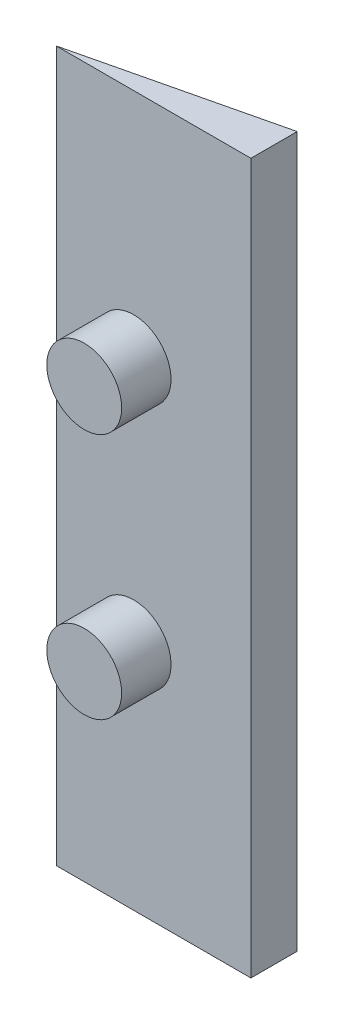
ISO-10303-21;
HEADER;
FILE_DESCRIPTION(('STEP AP214'),'2;1');
FILE_NAME('part.step','',(''),(''),'','','');
FILE_SCHEMA(('AUTOMOTIVE_DESIGN { 1 0 10303 214 1 1 1 1 }'));
ENDSEC;
DATA;
#1=APPLICATION_CONTEXT('core data for automotive mechanical design processes');
#2=APPLICATION_PROTOCOL_DEFINITION('international standard','automotive_design',2000,#1);
#3=PRODUCT_CONTEXT('',#1,'mechanical');
#4=PRODUCT('Part','Part','',(#3));
#5=PRODUCT_RELATED_PRODUCT_CATEGORY('part','',(#4));
#6=PRODUCT_DEFINITION_FORMATION('','',#4);
#7=PRODUCT_DEFINITION_CONTEXT('part definition',#1,'design');
#8=PRODUCT_DEFINITION('design','',#6,#7);
#9=PRODUCT_DEFINITION_SHAPE('','',#8);
#10=(LENGTH_UNIT() NAMED_UNIT(*) SI_UNIT(.MILLI.,.METRE.));
#11=(NAMED_UNIT(*) PLANE_ANGLE_UNIT() SI_UNIT($,.RADIAN.));
#12=(NAMED_UNIT(*) SI_UNIT($,.STERADIAN.) SOLID_ANGLE_UNIT());
#13=UNCERTAINTY_MEASURE_WITH_UNIT(LENGTH_MEASURE(1.E-05),#10,'distance_accuracy_value','');
#14=(GEOMETRIC_REPRESENTATION_CONTEXT(3) GLOBAL_UNCERTAINTY_ASSIGNED_CONTEXT((#13)) GLOBAL_UNIT_ASSIGNED_CONTEXT((#10,
#11,#12)) REPRESENTATION_CONTEXT('',''));
#15=CARTESIAN_POINT('',(0.,0.,0.));
#16=DIRECTION('',(0.,0.,1.));
#17=DIRECTION('',(1.,0.,0.));
#18=AXIS2_PLACEMENT_3D('',#15,#16,#17);
#19=CARTESIAN_POINT('',(6.3,23.,-3.));
#20=DIRECTION('',(-1.,0.,0.));
#21=DIRECTION('',(0.,0.,1.));
#22=AXIS2_PLACEMENT_3D('',#19,#20,#21);
#23=PLANE('',#22);
#24=DIRECTION('',(0.,0.,-1.));
#25=VECTOR('',#24,1.);
#26=CARTESIAN_POINT('',(6.3,-23.,-3.));
#27=LINE('',#26,#25);
#28=CARTESIAN_POINT('',(6.3,-23.,0.));
#29=VERTEX_POINT('',#28);
#30=CARTESIAN_POINT('',(6.3,-23.,-3.));
#31=VERTEX_POINT('',#30);
#32=EDGE_CURVE('E83',#29,#31,#27,.T.);
#33=ORIENTED_EDGE('',*,*,#32,.T.);
#34=DIRECTION('',(0.,-1.,0.));
#35=VECTOR('',#34,1.);
#36=CARTESIAN_POINT('',(6.3,23.,-3.));
#37=LINE('',#36,#35);
#38=CARTESIAN_POINT('',(6.3,23.,-3.));
#39=VERTEX_POINT('',#38);
#40=EDGE_CURVE('E73',#39,#31,#37,.T.);
#41=ORIENTED_EDGE('',*,*,#40,.F.);
#42=DIRECTION('',(0.,0.,-1.));
#43=VECTOR('',#42,1.);
#44=CARTESIAN_POINT('',(6.3,23.,-3.));
#45=LINE('',#44,#43);
#46=CARTESIAN_POINT('',(6.3,23.,0.));
#47=VERTEX_POINT('',#46);
#48=EDGE_CURVE('E76',#47,#39,#45,.T.);
#49=ORIENTED_EDGE('',*,*,#48,.F.);
#50=DIRECTION('',(0.,-1.,0.));
#51=VECTOR('',#50,1.);
#52=CARTESIAN_POINT('',(6.3,23.,0.));
#53=LINE('',#52,#51);
#54=EDGE_CURVE('E86',#47,#29,#53,.T.);
#55=ORIENTED_EDGE('',*,*,#54,.T.);
#56=EDGE_LOOP('',(#33,#41,#49,#55));
#57=FACE_BOUND('',#56,.T.);
#58=ADVANCED_FACE('F33',(#57),#23,.F.);
#59=CARTESIAN_POINT('',(-6.3,23.,0.));
#60=DIRECTION('',(0.23162052730604,0.,0.972806214685367));
#61=DIRECTION('',(0.972806214685367,0.,-0.23162052730604));
#62=AXIS2_PLACEMENT_3D('',#59,#60,#61);
#63=PLANE('',#62);
#64=DIRECTION('',(-0.972806214685367,0.,0.23162052730604));
#65=VECTOR('',#64,1.);
#66=CARTESIAN_POINT('',(-6.3,-23.,0.));
#67=LINE('',#66,#65);
#68=CARTESIAN_POINT('',(-6.3,-23.,0.));
#69=VERTEX_POINT('',#68);
#70=EDGE_CURVE('E62',#31,#69,#67,.T.);
#71=ORIENTED_EDGE('',*,*,#70,.T.);
#72=DIRECTION('',(0.,-1.,0.));
#73=VECTOR('',#72,1.);
#74=CARTESIAN_POINT('',(-6.3,23.,0.));
#75=LINE('',#74,#73);
#76=CARTESIAN_POINT('',(-6.3,23.,0.));
#77=VERTEX_POINT('',#76);
#78=EDGE_CURVE('E75',#77,#69,#75,.T.);
#79=ORIENTED_EDGE('',*,*,#78,.F.);
#80=DIRECTION('',(-0.972806214685367,0.,0.23162052730604));
#81=VECTOR('',#80,1.);
#82=CARTESIAN_POINT('',(-6.3,23.,0.));
#83=LINE('',#82,#81);
#84=EDGE_CURVE('E70',#39,#77,#83,.T.);
#85=ORIENTED_EDGE('',*,*,#84,.F.);
#86=ORIENTED_EDGE('',*,*,#40,.T.);
#87=EDGE_LOOP('',(#71,#79,#85,#86));
#88=FACE_BOUND('',#87,.T.);
#89=ADVANCED_FACE('F71',(#88),#63,.F.);
#90=CARTESIAN_POINT('',(-6.3,23.,0.));
#91=DIRECTION('',(0.,0.,-1.));
#92=DIRECTION('',(-1.,0.,0.));
#93=AXIS2_PLACEMENT_3D('',#90,#91,#92);
#94=PLANE('',#93);
#95=CARTESIAN_POINT('',(-1.3,-8.,0.));
#96=DIRECTION('',(0.,0.,-1.));
#97=DIRECTION('',(-1.,0.,0.));
#98=AXIS2_PLACEMENT_3D('',#95,#96,#97);
#99=CIRCLE('',#98,2.425);
#100=CARTESIAN_POINT('',(-3.725,-8.,0.));
#101=VERTEX_POINT('',#100);
#102=EDGE_CURVE('E11',#101,#101,#99,.F.);
#103=ORIENTED_EDGE('',*,*,#102,.F.);
#104=EDGE_LOOP('',(#103));
#105=FACE_BOUND('',#104,.T.);
#106=CARTESIAN_POINT('',(-1.3,8.,0.));
#107=DIRECTION('',(0.,0.,-1.));
#108=DIRECTION('',(-1.,0.,0.));
#109=AXIS2_PLACEMENT_3D('',#106,#107,#108);
#110=CIRCLE('',#109,2.425);
#111=CARTESIAN_POINT('',(-3.725,8.,0.));
#112=VERTEX_POINT('',#111);
#113=EDGE_CURVE('E41',#112,#112,#110,.F.);
#114=ORIENTED_EDGE('',*,*,#113,.F.);
#115=EDGE_LOOP('',(#114));
#116=FACE_BOUND('',#115,.T.);
#117=DIRECTION('',(1.,0.,0.));
#118=VECTOR('',#117,1.);
#119=CARTESIAN_POINT('',(-6.3,-23.,0.));
#120=LINE('',#119,#118);
#121=EDGE_CURVE('E67',#69,#29,#120,.T.);
#122=ORIENTED_EDGE('',*,*,#121,.T.);
#123=ORIENTED_EDGE('',*,*,#54,.F.);
#124=DIRECTION('',(1.,0.,0.));
#125=VECTOR('',#124,1.);
#126=CARTESIAN_POINT('',(-6.3,23.,0.));
#127=LINE('',#126,#125);
#128=EDGE_CURVE('E49',#77,#47,#127,.T.);
#129=ORIENTED_EDGE('',*,*,#128,.F.);
#130=ORIENTED_EDGE('',*,*,#78,.T.);
#131=EDGE_LOOP('',(#122,#123,#129,#130));
#132=FACE_BOUND('',#131,.T.);
#133=ADVANCED_FACE('F110',(#105,#116,#132),#94,.F.);
#134=CARTESIAN_POINT('',(0.,23.,0.));
#135=DIRECTION('',(0.,1.,0.));
#136=DIRECTION('',(0.,0.,1.));
#137=AXIS2_PLACEMENT_3D('',#134,#135,#136);
#138=PLANE('',#137);
#139=ORIENTED_EDGE('',*,*,#48,.T.);
#140=ORIENTED_EDGE('',*,*,#84,.T.);
#141=ORIENTED_EDGE('',*,*,#128,.T.);
#142=EDGE_LOOP('',(#139,#140,#141));
#143=FACE_BOUND('',#142,.T.);
#144=ADVANCED_FACE('F79',(#143),#138,.T.);
#145=CARTESIAN_POINT('',(0.,-23.,0.));
#146=DIRECTION('',(0.,1.,0.));
#147=DIRECTION('',(0.,0.,1.));
#148=AXIS2_PLACEMENT_3D('',#145,#146,#147);
#149=PLANE('',#148);
#150=ORIENTED_EDGE('',*,*,#32,.F.);
#151=ORIENTED_EDGE('',*,*,#121,.F.);
#152=ORIENTED_EDGE('',*,*,#70,.F.);
#153=EDGE_LOOP('',(#150,#151,#152));
#154=FACE_BOUND('',#153,.T.);
#155=ADVANCED_FACE('F118',(#154),#149,.F.);
#156=CARTESIAN_POINT('',(-1.3,8.,3.2));
#157=DIRECTION('',(0.,0.,-1.));
#158=DIRECTION('',(-1.,0.,0.));
#159=AXIS2_PLACEMENT_3D('',#156,#157,#158);
#160=CYLINDRICAL_SURFACE('',#159,2.425);
#161=CARTESIAN_POINT('',(-1.3,8.,3.2));
#162=DIRECTION('',(0.,0.,1.));
#163=DIRECTION('',(1.,0.,0.));
#164=AXIS2_PLACEMENT_3D('',#161,#162,#163);
#165=CIRCLE('',#164,2.425);
#166=CARTESIAN_POINT('',(1.125,8.,3.2));
#167=VERTEX_POINT('',#166);
#168=EDGE_CURVE('E93',#167,#167,#165,.T.);
#169=ORIENTED_EDGE('',*,*,#168,.F.);
#170=EDGE_LOOP('',(#169));
#171=FACE_BOUND('',#170,.T.);
#172=ORIENTED_EDGE('',*,*,#113,.T.);
#173=EDGE_LOOP('',(#172));
#174=FACE_BOUND('',#173,.T.);
#175=ADVANCED_FACE('F116',(#171,#174),#160,.T.);
#176=CARTESIAN_POINT('',(-1.3,8.,3.2));
#177=DIRECTION('',(0.,0.,1.));
#178=DIRECTION('',(1.,0.,0.));
#179=AXIS2_PLACEMENT_3D('',#176,#177,#178);
#180=PLANE('',#179);
#181=ORIENTED_EDGE('',*,*,#168,.T.);
#182=EDGE_LOOP('',(#181));
#183=FACE_BOUND('',#182,.T.);
#184=ADVANCED_FACE('F106',(#183),#180,.T.);
#185=CARTESIAN_POINT('',(-1.3,-8.,3.2));
#186=DIRECTION('',(0.,0.,-1.));
#187=DIRECTION('',(-1.,0.,0.));
#188=AXIS2_PLACEMENT_3D('',#185,#186,#187);
#189=CYLINDRICAL_SURFACE('',#188,2.425);
#190=CARTESIAN_POINT('',(-1.3,-8.,3.2));
#191=DIRECTION('',(0.,0.,1.));
#192=DIRECTION('',(1.,0.,0.));
#193=AXIS2_PLACEMENT_3D('',#190,#191,#192);
#194=CIRCLE('',#193,2.425);
#195=CARTESIAN_POINT('',(1.125,-8.,3.2));
#196=VERTEX_POINT('',#195);
#197=EDGE_CURVE('E97',#196,#196,#194,.T.);
#198=ORIENTED_EDGE('',*,*,#197,.F.);
#199=EDGE_LOOP('',(#198));
#200=FACE_BOUND('',#199,.T.);
#201=ORIENTED_EDGE('',*,*,#102,.T.);
#202=EDGE_LOOP('',(#201));
#203=FACE_BOUND('',#202,.T.);
#204=ADVANCED_FACE('F103',(#200,#203),#189,.T.);
#205=CARTESIAN_POINT('',(-1.3,-8.,3.2));
#206=DIRECTION('',(0.,0.,1.));
#207=DIRECTION('',(1.,0.,0.));
#208=AXIS2_PLACEMENT_3D('',#205,#206,#207);
#209=PLANE('',#208);
#210=ORIENTED_EDGE('',*,*,#197,.T.);
#211=EDGE_LOOP('',(#210));
#212=FACE_BOUND('',#211,.T.);
#213=ADVANCED_FACE('F101',(#212),#209,.T.);
#214=CLOSED_SHELL('',(#58,#89,#133,#144,#155,#175,#184,#204,#213));
#215=MANIFOLD_SOLID_BREP('B2',#214);
#216=ADVANCED_BREP_SHAPE_REPRESENTATION('',(#18,#215),#14);
#217=SHAPE_DEFINITION_REPRESENTATION(#9,#216);
ENDSEC;
END-ISO-10303-21;
